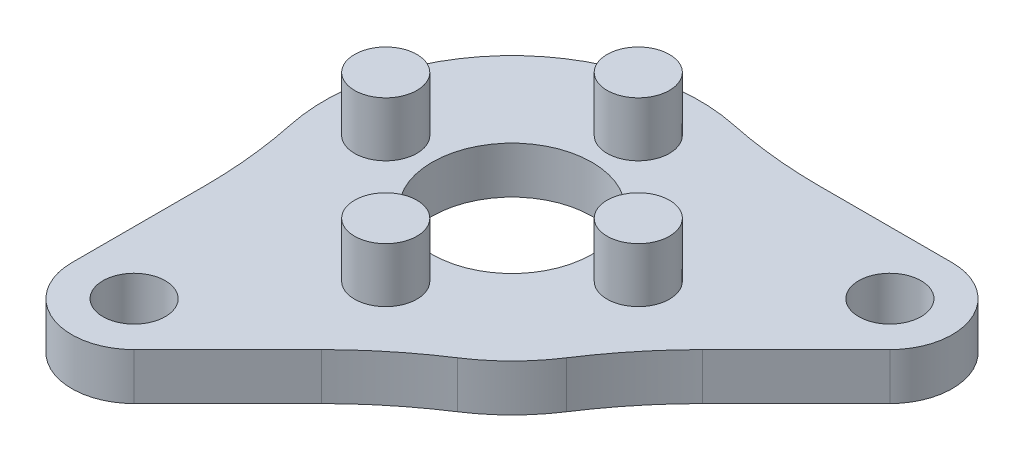
ISO-10303-21;
HEADER;
FILE_DESCRIPTION(('STEP AP214'),'2;1');
FILE_NAME('part.step','',(''),(''),'','','');
FILE_SCHEMA(('AUTOMOTIVE_DESIGN { 1 0 10303 214 1 1 1 1 }'));
ENDSEC;
DATA;
#1=APPLICATION_CONTEXT('core data for automotive mechanical design processes');
#2=APPLICATION_PROTOCOL_DEFINITION('international standard','automotive_design',2000,#1);
#3=PRODUCT_CONTEXT('',#1,'mechanical');
#4=PRODUCT('Part','Part','',(#3));
#5=PRODUCT_RELATED_PRODUCT_CATEGORY('part','',(#4));
#6=PRODUCT_DEFINITION_FORMATION('','',#4);
#7=PRODUCT_DEFINITION_CONTEXT('part definition',#1,'design');
#8=PRODUCT_DEFINITION('design','',#6,#7);
#9=PRODUCT_DEFINITION_SHAPE('','',#8);
#10=(LENGTH_UNIT() NAMED_UNIT(*) SI_UNIT(.MILLI.,.METRE.));
#11=(NAMED_UNIT(*) PLANE_ANGLE_UNIT() SI_UNIT($,.RADIAN.));
#12=(NAMED_UNIT(*) SI_UNIT($,.STERADIAN.) SOLID_ANGLE_UNIT());
#13=UNCERTAINTY_MEASURE_WITH_UNIT(LENGTH_MEASURE(1.E-05),#10,'distance_accuracy_value','');
#14=(GEOMETRIC_REPRESENTATION_CONTEXT(3) GLOBAL_UNCERTAINTY_ASSIGNED_CONTEXT((#13)) GLOBAL_UNIT_ASSIGNED_CONTEXT((#10,
#11,#12)) REPRESENTATION_CONTEXT('',''));
#15=CARTESIAN_POINT('',(0.,0.,0.));
#16=DIRECTION('',(0.,0.,1.));
#17=DIRECTION('',(1.,0.,0.));
#18=AXIS2_PLACEMENT_3D('',#15,#16,#17);
#19=CARTESIAN_POINT('',(7.84888527117066,3.,7.84888527117069));
#20=DIRECTION('',(-0.707106781186546,0.,-0.707106781186548));
#21=DIRECTION('',(-0.707106781186549,0.,0.707106781186546));
#22=AXIS2_PLACEMENT_3D('',#19,#20,#21);
#23=PLANE('',#22);
#24=DIRECTION('',(0.707106781186549,0.,-0.707106781186546));
#25=VECTOR('',#24,1.);
#26=CARTESIAN_POINT('',(7.84888527117066,3.,7.84888527117069));
#27=LINE('',#26,#25);
#28=CARTESIAN_POINT('',(13.9640304043626,3.,1.73374013797876));
#29=VERTEX_POINT('',#28);
#30=CARTESIAN_POINT('',(19.9693434175952,3.,-4.27157287525381));
#31=VERTEX_POINT('',#30);
#32=EDGE_CURVE('E141',#29,#31,#27,.T.);
#33=ORIENTED_EDGE('',*,*,#32,.F.);
#34=DIRECTION('',(0.,1.,0.));
#35=VECTOR('',#34,1.);
#36=CARTESIAN_POINT('',(13.9640304043626,3.,1.73374013797876));
#37=LINE('',#36,#35);
#38=CARTESIAN_POINT('',(13.9640304043626,0.,1.73374013797876));
#39=VERTEX_POINT('',#38);
#40=EDGE_CURVE('E166',#29,#39,#37,.F.);
#41=ORIENTED_EDGE('',*,*,#40,.T.);
#42=DIRECTION('',(0.707106781186549,0.,-0.707106781186546));
#43=VECTOR('',#42,1.);
#44=CARTESIAN_POINT('',(7.84888527117066,0.,7.84888527117069));
#45=LINE('',#44,#43);
#46=CARTESIAN_POINT('',(19.9693434175952,0.,-4.27157287525381));
#47=VERTEX_POINT('',#46);
#48=EDGE_CURVE('E229',#39,#47,#45,.T.);
#49=ORIENTED_EDGE('',*,*,#48,.T.);
#50=DIRECTION('',(0.,-1.,0.));
#51=VECTOR('',#50,1.);
#52=CARTESIAN_POINT('',(19.9693434175952,3.,-4.27157287525381));
#53=LINE('',#52,#51);
#54=EDGE_CURVE('E151',#31,#47,#53,.T.);
#55=ORIENTED_EDGE('',*,*,#54,.F.);
#56=EDGE_LOOP('',(#33,#41,#49,#55));
#57=FACE_BOUND('',#56,.T.);
#58=ADVANCED_FACE('F37',(#57),#23,.F.);
#59=CARTESIAN_POINT('',(-11.1,3.,0.));
#60=DIRECTION('',(1.,0.,0.));
#61=DIRECTION('',(0.,0.,-1.));
#62=AXIS2_PLACEMENT_3D('',#59,#60,#61);
#63=PLANE('',#62);
#64=DIRECTION('',(0.,0.,1.));
#65=VECTOR('',#64,1.);
#66=CARTESIAN_POINT('',(-11.1,3.,0.));
#67=LINE('',#66,#65);
#68=CARTESIAN_POINT('',(-11.1,3.,8.64812118323973));
#69=VERTEX_POINT('',#68);
#70=CARTESIAN_POINT('',(-11.1000000000001,3.,17.140916292849));
#71=VERTEX_POINT('',#70);
#72=EDGE_CURVE('E122',#69,#71,#67,.T.);
#73=ORIENTED_EDGE('',*,*,#72,.F.);
#74=DIRECTION('',(0.,1.,0.));
#75=VECTOR('',#74,1.);
#76=CARTESIAN_POINT('',(-11.1,3.,8.64812118323973));
#77=LINE('',#76,#75);
#78=CARTESIAN_POINT('',(-11.1,0.,8.64812118323973));
#79=VERTEX_POINT('',#78);
#80=EDGE_CURVE('E169',#69,#79,#77,.F.);
#81=ORIENTED_EDGE('',*,*,#80,.T.);
#82=DIRECTION('',(0.,0.,1.));
#83=VECTOR('',#82,1.);
#84=CARTESIAN_POINT('',(-11.1,0.,0.));
#85=LINE('',#84,#83);
#86=CARTESIAN_POINT('',(-11.1000000000001,0.,17.140916292849));
#87=VERTEX_POINT('',#86);
#88=EDGE_CURVE('E145',#79,#87,#85,.T.);
#89=ORIENTED_EDGE('',*,*,#88,.T.);
#90=DIRECTION('',(0.,-1.,0.));
#91=VECTOR('',#90,1.);
#92=CARTESIAN_POINT('',(-11.1000000000001,3.,17.140916292849));
#93=LINE('',#92,#91);
#94=EDGE_CURVE('E137',#71,#87,#93,.T.);
#95=ORIENTED_EDGE('',*,*,#94,.F.);
#96=EDGE_LOOP('',(#73,#81,#89,#95));
#97=FACE_BOUND('',#96,.T.);
#98=ADVANCED_FACE('F143',(#97),#63,.F.);
#99=CARTESIAN_POINT('',(-7.10000000000005,3.,17.140916292849));
#100=DIRECTION('',(0.,-1.,0.));
#101=DIRECTION('',(0.,0.,-1.));
#102=AXIS2_PLACEMENT_3D('',#99,#100,#101);
#103=CYLINDRICAL_SURFACE('',#102,4.);
#104=CARTESIAN_POINT('',(-7.10000000000005,0.,17.140916292849));
#105=DIRECTION('',(0.,1.,0.));
#106=DIRECTION('',(0.,0.,1.));
#107=AXIS2_PLACEMENT_3D('',#104,#105,#106);
#108=CIRCLE('',#107,4.);
#109=CARTESIAN_POINT('',(-4.27157287525387,0.,19.9693434175952));
#110=VERTEX_POINT('',#109);
#111=EDGE_CURVE('E296',#87,#110,#108,.T.);
#112=ORIENTED_EDGE('',*,*,#111,.T.);
#113=DIRECTION('',(0.,-1.,0.));
#114=VECTOR('',#113,1.);
#115=CARTESIAN_POINT('',(-4.27157287525387,3.,19.9693434175952));
#116=LINE('',#115,#114);
#117=CARTESIAN_POINT('',(-4.27157287525387,3.,19.9693434175952));
#118=VERTEX_POINT('',#117);
#119=EDGE_CURVE('E139',#118,#110,#116,.T.);
#120=ORIENTED_EDGE('',*,*,#119,.F.);
#121=CARTESIAN_POINT('',(-7.10000000000005,3.,17.140916292849));
#122=DIRECTION('',(0.,1.,0.));
#123=DIRECTION('',(0.,0.,1.));
#124=AXIS2_PLACEMENT_3D('',#121,#122,#123);
#125=CIRCLE('',#124,4.);
#126=EDGE_CURVE('E128',#71,#118,#125,.T.);
#127=ORIENTED_EDGE('',*,*,#126,.F.);
#128=ORIENTED_EDGE('',*,*,#94,.T.);
#129=EDGE_LOOP('',(#112,#120,#127,#128));
#130=FACE_BOUND('',#129,.T.);
#131=ADVANCED_FACE('F136',(#130),#103,.T.);
#132=CARTESIAN_POINT('',(1.73374013797871,0.,13.9640304043626));
#133=VERTEX_POINT('',#132);
#134=EDGE_CURVE('E226',#110,#133,#45,.T.);
#135=ORIENTED_EDGE('',*,*,#134,.T.);
#136=DIRECTION('',(0.,1.,0.));
#137=VECTOR('',#136,1.);
#138=CARTESIAN_POINT('',(1.73374013797871,3.,13.9640304043626));
#139=LINE('',#138,#137);
#140=CARTESIAN_POINT('',(1.73374013797871,3.,13.9640304043626));
#141=VERTEX_POINT('',#140);
#142=EDGE_CURVE('E159',#133,#141,#139,.T.);
#143=ORIENTED_EDGE('',*,*,#142,.T.);
#144=EDGE_CURVE('E238',#118,#141,#27,.T.);
#145=ORIENTED_EDGE('',*,*,#144,.F.);
#146=ORIENTED_EDGE('',*,*,#119,.T.);
#147=EDGE_LOOP('',(#135,#143,#145,#146));
#148=FACE_BOUND('',#147,.T.);
#149=ADVANCED_FACE('F205',(#148),#23,.F.);
#150=CARTESIAN_POINT('',(17.140916292849,3.,-7.1));
#151=DIRECTION('',(0.,-1.,0.));
#152=DIRECTION('',(0.,0.,-1.));
#153=AXIS2_PLACEMENT_3D('',#150,#151,#152);
#154=CYLINDRICAL_SURFACE('',#153,4.);
#155=CARTESIAN_POINT('',(17.140916292849,0.,-7.1));
#156=DIRECTION('',(0.,1.,0.));
#157=DIRECTION('',(0.,0.,1.));
#158=AXIS2_PLACEMENT_3D('',#155,#156,#157);
#159=CIRCLE('',#158,4.);
#160=CARTESIAN_POINT('',(17.140916292849,0.,-11.1));
#161=VERTEX_POINT('',#160);
#162=EDGE_CURVE('E228',#161,#47,#159,.F.);
#163=ORIENTED_EDGE('',*,*,#162,.F.);
#164=DIRECTION('',(0.,-1.,0.));
#165=VECTOR('',#164,1.);
#166=CARTESIAN_POINT('',(17.140916292849,3.,-11.1));
#167=LINE('',#166,#165);
#168=CARTESIAN_POINT('',(17.140916292849,3.,-11.1));
#169=VERTEX_POINT('',#168);
#170=EDGE_CURVE('E286',#169,#161,#167,.T.);
#171=ORIENTED_EDGE('',*,*,#170,.F.);
#172=CARTESIAN_POINT('',(17.140916292849,3.,-7.1));
#173=DIRECTION('',(0.,1.,0.));
#174=DIRECTION('',(0.,0.,1.));
#175=AXIS2_PLACEMENT_3D('',#172,#173,#174);
#176=CIRCLE('',#175,4.);
#177=EDGE_CURVE('E281',#169,#31,#176,.F.);
#178=ORIENTED_EDGE('',*,*,#177,.T.);
#179=ORIENTED_EDGE('',*,*,#54,.T.);
#180=EDGE_LOOP('',(#163,#171,#178,#179));
#181=FACE_BOUND('',#180,.T.);
#182=ADVANCED_FACE('F215',(#181),#154,.T.);
#183=CARTESIAN_POINT('',(0.,3.,-11.1));
#184=DIRECTION('',(0.,0.,-1.));
#185=DIRECTION('',(-1.,0.,0.));
#186=AXIS2_PLACEMENT_3D('',#183,#184,#185);
#187=PLANE('',#186);
#188=DIRECTION('',(1.,0.,0.));
#189=VECTOR('',#188,1.);
#190=CARTESIAN_POINT('',(0.,0.,-11.1));
#191=LINE('',#190,#189);
#192=CARTESIAN_POINT('',(8.64812118323977,0.,-11.1));
#193=VERTEX_POINT('',#192);
#194=EDGE_CURVE('E275',#193,#161,#191,.T.);
#195=ORIENTED_EDGE('',*,*,#194,.F.);
#196=DIRECTION('',(0.,-1.,0.));
#197=VECTOR('',#196,1.);
#198=CARTESIAN_POINT('',(8.64812118323977,3.,-11.1));
#199=LINE('',#198,#197);
#200=CARTESIAN_POINT('',(8.64812118323977,3.,-11.1));
#201=VERTEX_POINT('',#200);
#202=EDGE_CURVE('E157',#193,#201,#199,.F.);
#203=ORIENTED_EDGE('',*,*,#202,.T.);
#204=DIRECTION('',(1.,0.,0.));
#205=VECTOR('',#204,1.);
#206=CARTESIAN_POINT('',(0.,3.,-11.1));
#207=LINE('',#206,#205);
#208=EDGE_CURVE('E284',#201,#169,#207,.T.);
#209=ORIENTED_EDGE('',*,*,#208,.T.);
#210=ORIENTED_EDGE('',*,*,#170,.T.);
#211=EDGE_LOOP('',(#195,#203,#209,#210));
#212=FACE_BOUND('',#211,.T.);
#213=ADVANCED_FACE('F221',(#212),#187,.T.);
#214=CARTESIAN_POINT('',(17.140916292849,3.,-7.1));
#215=DIRECTION('',(0.,-1.,0.));
#216=DIRECTION('',(0.,0.,-1.));
#217=AXIS2_PLACEMENT_3D('',#214,#215,#216);
#218=CYLINDRICAL_SURFACE('',#217,2.);
#219=CARTESIAN_POINT('',(17.140916292849,3.,-7.1));
#220=DIRECTION('',(0.,1.,0.));
#221=DIRECTION('',(0.,0.,1.));
#222=AXIS2_PLACEMENT_3D('',#219,#220,#221);
#223=CIRCLE('',#222,2.);
#224=CARTESIAN_POINT('',(17.140916292849,3.,-5.1));
#225=VERTEX_POINT('',#224);
#226=EDGE_CURVE('E132',#225,#225,#223,.T.);
#227=ORIENTED_EDGE('',*,*,#226,.T.);
#228=EDGE_LOOP('',(#227));
#229=FACE_BOUND('',#228,.T.);
#230=CARTESIAN_POINT('',(17.140916292849,0.,-7.1));
#231=DIRECTION('',(0.,1.,0.));
#232=DIRECTION('',(0.,0.,1.));
#233=AXIS2_PLACEMENT_3D('',#230,#231,#232);
#234=CIRCLE('',#233,2.);
#235=CARTESIAN_POINT('',(17.140916292849,0.,-5.1));
#236=VERTEX_POINT('',#235);
#237=EDGE_CURVE('E292',#236,#236,#234,.T.);
#238=ORIENTED_EDGE('',*,*,#237,.F.);
#239=EDGE_LOOP('',(#238));
#240=FACE_BOUND('',#239,.T.);
#241=ADVANCED_FACE('F331',(#229,#240),#218,.F.);
#242=CARTESIAN_POINT('',(-7.10000000000005,3.,17.140916292849));
#243=DIRECTION('',(0.,-1.,0.));
#244=DIRECTION('',(0.,0.,-1.));
#245=AXIS2_PLACEMENT_3D('',#242,#243,#244);
#246=CYLINDRICAL_SURFACE('',#245,2.);
#247=CARTESIAN_POINT('',(-7.10000000000005,3.,17.140916292849));
#248=DIRECTION('',(0.,1.,0.));
#249=DIRECTION('',(0.,0.,1.));
#250=AXIS2_PLACEMENT_3D('',#247,#248,#249);
#251=CIRCLE('',#250,2.);
#252=CARTESIAN_POINT('',(-7.10000000000005,3.,19.140916292849));
#253=VERTEX_POINT('',#252);
#254=EDGE_CURVE('E274',#253,#253,#251,.F.);
#255=ORIENTED_EDGE('',*,*,#254,.F.);
#256=EDGE_LOOP('',(#255));
#257=FACE_BOUND('',#256,.T.);
#258=CARTESIAN_POINT('',(-7.10000000000005,0.,17.140916292849));
#259=DIRECTION('',(0.,1.,0.));
#260=DIRECTION('',(0.,0.,1.));
#261=AXIS2_PLACEMENT_3D('',#258,#259,#260);
#262=CIRCLE('',#261,2.);
#263=CARTESIAN_POINT('',(-7.10000000000005,0.,19.140916292849));
#264=VERTEX_POINT('',#263);
#265=EDGE_CURVE('E289',#264,#264,#262,.F.);
#266=ORIENTED_EDGE('',*,*,#265,.T.);
#267=EDGE_LOOP('',(#266));
#268=FACE_BOUND('',#267,.T.);
#269=ADVANCED_FACE('F327',(#257,#268),#246,.F.);
#270=CARTESIAN_POINT('',(0.,3.,0.));
#271=DIRECTION('',(0.,-1.,0.));
#272=DIRECTION('',(0.,0.,-1.));
#273=AXIS2_PLACEMENT_3D('',#270,#271,#272);
#274=CYLINDRICAL_SURFACE('',#273,5.125);
#275=CARTESIAN_POINT('',(0.,3.,0.));
#276=DIRECTION('',(0.,1.,0.));
#277=DIRECTION('',(0.,0.,1.));
#278=AXIS2_PLACEMENT_3D('',#275,#276,#277);
#279=CIRCLE('',#278,5.125);
#280=CARTESIAN_POINT('',(0.,3.,5.125));
#281=VERTEX_POINT('',#280);
#282=EDGE_CURVE('E271',#281,#281,#279,.T.);
#283=ORIENTED_EDGE('',*,*,#282,.T.);
#284=EDGE_LOOP('',(#283));
#285=FACE_BOUND('',#284,.T.);
#286=CARTESIAN_POINT('',(0.,0.,0.));
#287=DIRECTION('',(0.,1.,0.));
#288=DIRECTION('',(0.,0.,1.));
#289=AXIS2_PLACEMENT_3D('',#286,#287,#288);
#290=CIRCLE('',#289,5.125);
#291=CARTESIAN_POINT('',(0.,0.,5.125));
#292=VERTEX_POINT('',#291);
#293=EDGE_CURVE('E268',#292,#292,#290,.T.);
#294=ORIENTED_EDGE('',*,*,#293,.F.);
#295=EDGE_LOOP('',(#294));
#296=FACE_BOUND('',#295,.T.);
#297=ADVANCED_FACE('F324',(#285,#296),#274,.F.);
#298=CARTESIAN_POINT('',(0.,3.,0.));
#299=DIRECTION('',(0.,1.,0.));
#300=DIRECTION('',(0.,0.,1.));
#301=AXIS2_PLACEMENT_3D('',#298,#299,#300);
#302=PLANE('',#301);
#303=ORIENTED_EDGE('',*,*,#208,.F.);
#304=CARTESIAN_POINT('',(8.64812118323977,3.,-41.1));
#305=DIRECTION('',(0.,1.,0.));
#306=DIRECTION('',(0.,0.,1.));
#307=AXIS2_PLACEMENT_3D('',#304,#305,#306);
#308=CIRCLE('',#307,30.);
#309=CARTESIAN_POINT('',(2.47089176663993,3.,-11.7428571428571));
#310=VERTEX_POINT('',#309);
#311=EDGE_CURVE('E173',#201,#310,#308,.F.);
#312=ORIENTED_EDGE('',*,*,#311,.T.);
#313=CARTESIAN_POINT('',(0.,3.,0.));
#314=DIRECTION('',(0.,1.,0.));
#315=DIRECTION('',(0.,0.,1.));
#316=AXIS2_PLACEMENT_3D('',#313,#314,#315);
#317=CIRCLE('',#316,12.);
#318=CARTESIAN_POINT('',(-11.7428571428572,3.,2.4708917666399));
#319=VERTEX_POINT('',#318);
#320=EDGE_CURVE('E244',#310,#319,#317,.T.);
#321=ORIENTED_EDGE('',*,*,#320,.T.);
#322=CARTESIAN_POINT('',(-41.1,3.,8.64812118323964));
#323=DIRECTION('',(0.,1.,0.));
#324=DIRECTION('',(0.,0.,1.));
#325=AXIS2_PLACEMENT_3D('',#322,#323,#324);
#326=CIRCLE('',#325,30.);
#327=EDGE_CURVE('E11',#319,#69,#326,.F.);
#328=ORIENTED_EDGE('',*,*,#327,.T.);
#329=ORIENTED_EDGE('',*,*,#72,.T.);
#330=ORIENTED_EDGE('',*,*,#126,.T.);
#331=ORIENTED_EDGE('',*,*,#144,.T.);
#332=CARTESIAN_POINT('',(22.9469435735751,3.,35.1772338399591));
#333=DIRECTION('',(0.,1.,0.));
#334=DIRECTION('',(0.,0.,1.));
#335=AXIS2_PLACEMENT_3D('',#332,#333,#334);
#336=CIRCLE('',#335,30.);
#337=CARTESIAN_POINT('',(6.55626959245003,3.,10.0506382399883));
#338=VERTEX_POINT('',#337);
#339=EDGE_CURVE('E175',#141,#338,#336,.F.);
#340=ORIENTED_EDGE('',*,*,#339,.T.);
#341=CARTESIAN_POINT('',(10.0506382399883,3.,6.55626959245006));
#342=VERTEX_POINT('',#341);
#343=EDGE_CURVE('E236',#338,#342,#317,.T.);
#344=ORIENTED_EDGE('',*,*,#343,.T.);
#345=CARTESIAN_POINT('',(35.177233839959,3.,22.9469435735752));
#346=DIRECTION('',(0.,1.,0.));
#347=DIRECTION('',(0.,0.,1.));
#348=AXIS2_PLACEMENT_3D('',#345,#346,#347);
#349=CIRCLE('',#348,30.);
#350=EDGE_CURVE('E181',#342,#29,#349,.F.);
#351=ORIENTED_EDGE('',*,*,#350,.T.);
#352=ORIENTED_EDGE('',*,*,#32,.T.);
#353=ORIENTED_EDGE('',*,*,#177,.F.);
#354=EDGE_LOOP('',(#303,#312,#321,#328,#329,#330,#331,#340,#344,#351,#352,#353));
#355=FACE_BOUND('',#354,.T.);
#356=ORIENTED_EDGE('',*,*,#254,.T.);
#357=EDGE_LOOP('',(#356));
#358=FACE_BOUND('',#357,.T.);
#359=CARTESIAN_POINT('',(-8.1,3.,0.));
#360=DIRECTION('',(0.,1.,0.));
#361=DIRECTION('',(0.,0.,1.));
#362=AXIS2_PLACEMENT_3D('',#359,#360,#361);
#363=CIRCLE('',#362,2.);
#364=CARTESIAN_POINT('',(-8.1,3.,1.99999999999998));
#365=VERTEX_POINT('',#364);
#366=EDGE_CURVE('E192',#365,#365,#363,.T.);
#367=ORIENTED_EDGE('',*,*,#366,.F.);
#368=EDGE_LOOP('',(#367));
#369=FACE_BOUND('',#368,.T.);
#370=CARTESIAN_POINT('',(8.1,3.,0.));
#371=DIRECTION('',(0.,1.,0.));
#372=DIRECTION('',(0.,0.,-1.));
#373=AXIS2_PLACEMENT_3D('',#370,#371,#372);
#374=CIRCLE('',#373,2.);
#375=CARTESIAN_POINT('',(8.1,3.,-1.99999999999997));
#376=VERTEX_POINT('',#375);
#377=EDGE_CURVE('E250',#376,#376,#374,.T.);
#378=ORIENTED_EDGE('',*,*,#377,.F.);
#379=EDGE_LOOP('',(#378));
#380=FACE_BOUND('',#379,.T.);
#381=CARTESIAN_POINT('',(0.,3.,-8.1));
#382=DIRECTION('',(0.,1.,0.));
#383=DIRECTION('',(0.,0.,-1.));
#384=AXIS2_PLACEMENT_3D('',#381,#382,#383);
#385=CIRCLE('',#384,2.);
#386=CARTESIAN_POINT('',(0.,3.,-10.1));
#387=VERTEX_POINT('',#386);
#388=EDGE_CURVE('E256',#387,#387,#385,.T.);
#389=ORIENTED_EDGE('',*,*,#388,.F.);
#390=EDGE_LOOP('',(#389));
#391=FACE_BOUND('',#390,.T.);
#392=CARTESIAN_POINT('',(0.,3.,8.1));
#393=DIRECTION('',(0.,1.,0.));
#394=DIRECTION('',(0.,0.,1.));
#395=AXIS2_PLACEMENT_3D('',#392,#393,#394);
#396=CIRCLE('',#395,2.);
#397=CARTESIAN_POINT('',(0.,3.,10.1));
#398=VERTEX_POINT('',#397);
#399=EDGE_CURVE('E262',#398,#398,#396,.T.);
#400=ORIENTED_EDGE('',*,*,#399,.F.);
#401=EDGE_LOOP('',(#400));
#402=FACE_BOUND('',#401,.T.);
#403=ORIENTED_EDGE('',*,*,#282,.F.);
#404=EDGE_LOOP('',(#403));
#405=FACE_BOUND('',#404,.T.);
#406=ORIENTED_EDGE('',*,*,#226,.F.);
#407=EDGE_LOOP('',(#406));
#408=FACE_BOUND('',#407,.T.);
#409=ADVANCED_FACE('F125',(#355,#358,#369,#380,#391,#402,#405,#408),#302,.T.);
#410=CARTESIAN_POINT('',(0.,0.,0.));
#411=DIRECTION('',(0.,1.,0.));
#412=DIRECTION('',(0.,0.,1.));
#413=AXIS2_PLACEMENT_3D('',#410,#411,#412);
#414=PLANE('',#413);
#415=ORIENTED_EDGE('',*,*,#88,.F.);
#416=CARTESIAN_POINT('',(-41.1,0.,8.64812118323964));
#417=DIRECTION('',(0.,1.,0.));
#418=DIRECTION('',(0.,0.,1.));
#419=AXIS2_PLACEMENT_3D('',#416,#417,#418);
#420=CIRCLE('',#419,30.);
#421=CARTESIAN_POINT('',(-11.7428571428572,0.,2.4708917666399));
#422=VERTEX_POINT('',#421);
#423=EDGE_CURVE('E45',#79,#422,#420,.T.);
#424=ORIENTED_EDGE('',*,*,#423,.T.);
#425=CARTESIAN_POINT('',(0.,0.,0.));
#426=DIRECTION('',(0.,1.,0.));
#427=DIRECTION('',(0.,0.,1.));
#428=AXIS2_PLACEMENT_3D('',#425,#426,#427);
#429=CIRCLE('',#428,12.);
#430=CARTESIAN_POINT('',(2.47089176663993,0.,-11.7428571428571));
#431=VERTEX_POINT('',#430);
#432=EDGE_CURVE('E187',#422,#431,#429,.F.);
#433=ORIENTED_EDGE('',*,*,#432,.T.);
#434=CARTESIAN_POINT('',(8.64812118323977,0.,-41.1));
#435=DIRECTION('',(0.,1.,0.));
#436=DIRECTION('',(0.,0.,1.));
#437=AXIS2_PLACEMENT_3D('',#434,#435,#436);
#438=CIRCLE('',#437,30.);
#439=EDGE_CURVE('E171',#431,#193,#438,.T.);
#440=ORIENTED_EDGE('',*,*,#439,.T.);
#441=ORIENTED_EDGE('',*,*,#194,.T.);
#442=ORIENTED_EDGE('',*,*,#162,.T.);
#443=ORIENTED_EDGE('',*,*,#48,.F.);
#444=CARTESIAN_POINT('',(35.177233839959,0.,22.9469435735752));
#445=DIRECTION('',(0.,1.,0.));
#446=DIRECTION('',(0.,0.,1.));
#447=AXIS2_PLACEMENT_3D('',#444,#445,#446);
#448=CIRCLE('',#447,30.);
#449=CARTESIAN_POINT('',(10.0506382399883,0.,6.55626959245006));
#450=VERTEX_POINT('',#449);
#451=EDGE_CURVE('E179',#39,#450,#448,.T.);
#452=ORIENTED_EDGE('',*,*,#451,.T.);
#453=CARTESIAN_POINT('',(6.55626959245003,0.,10.0506382399883));
#454=VERTEX_POINT('',#453);
#455=EDGE_CURVE('E193',#450,#454,#429,.F.);
#456=ORIENTED_EDGE('',*,*,#455,.T.);
#457=CARTESIAN_POINT('',(22.9469435735751,0.,35.1772338399591));
#458=DIRECTION('',(0.,1.,0.));
#459=DIRECTION('',(0.,0.,1.));
#460=AXIS2_PLACEMENT_3D('',#457,#458,#459);
#461=CIRCLE('',#460,30.);
#462=EDGE_CURVE('E177',#454,#133,#461,.T.);
#463=ORIENTED_EDGE('',*,*,#462,.T.);
#464=ORIENTED_EDGE('',*,*,#134,.F.);
#465=ORIENTED_EDGE('',*,*,#111,.F.);
#466=EDGE_LOOP('',(#415,#424,#433,#440,#441,#442,#443,#452,#456,#463,#464,#465));
#467=FACE_BOUND('',#466,.T.);
#468=ORIENTED_EDGE('',*,*,#265,.F.);
#469=EDGE_LOOP('',(#468));
#470=FACE_BOUND('',#469,.T.);
#471=ORIENTED_EDGE('',*,*,#293,.T.);
#472=EDGE_LOOP('',(#471));
#473=FACE_BOUND('',#472,.T.);
#474=ORIENTED_EDGE('',*,*,#237,.T.);
#475=EDGE_LOOP('',(#474));
#476=FACE_BOUND('',#475,.T.);
#477=ADVANCED_FACE('F185',(#467,#470,#473,#476),#414,.F.);
#478=CARTESIAN_POINT('',(0.,6.5,8.1));
#479=DIRECTION('',(0.,-1.,0.));
#480=DIRECTION('',(0.,0.,-1.));
#481=AXIS2_PLACEMENT_3D('',#478,#479,#480);
#482=CYLINDRICAL_SURFACE('',#481,2.);
#483=CARTESIAN_POINT('',(0.,6.5,8.1));
#484=DIRECTION('',(0.,1.,0.));
#485=DIRECTION('',(0.,0.,1.));
#486=AXIS2_PLACEMENT_3D('',#483,#484,#485);
#487=CIRCLE('',#486,2.);
#488=CARTESIAN_POINT('',(0.,6.5,10.1));
#489=VERTEX_POINT('',#488);
#490=EDGE_CURVE('E265',#489,#489,#487,.T.);
#491=ORIENTED_EDGE('',*,*,#490,.F.);
#492=EDGE_LOOP('',(#491));
#493=FACE_BOUND('',#492,.T.);
#494=ORIENTED_EDGE('',*,*,#399,.T.);
#495=EDGE_LOOP('',(#494));
#496=FACE_BOUND('',#495,.T.);
#497=ADVANCED_FACE('F344',(#493,#496),#482,.T.);
#498=CARTESIAN_POINT('',(0.,6.5,8.1));
#499=DIRECTION('',(0.,1.,0.));
#500=DIRECTION('',(0.,0.,1.));
#501=AXIS2_PLACEMENT_3D('',#498,#499,#500);
#502=PLANE('',#501);
#503=ORIENTED_EDGE('',*,*,#490,.T.);
#504=EDGE_LOOP('',(#503));
#505=FACE_BOUND('',#504,.T.);
#506=ADVANCED_FACE('F351',(#505),#502,.T.);
#507=CARTESIAN_POINT('',(0.,6.5,-8.1));
#508=DIRECTION('',(0.,-1.,0.));
#509=DIRECTION('',(0.,0.,-1.));
#510=AXIS2_PLACEMENT_3D('',#507,#508,#509);
#511=CYLINDRICAL_SURFACE('',#510,2.);
#512=CARTESIAN_POINT('',(0.,6.5,-8.1));
#513=DIRECTION('',(0.,1.,0.));
#514=DIRECTION('',(0.,0.,-1.));
#515=AXIS2_PLACEMENT_3D('',#512,#513,#514);
#516=CIRCLE('',#515,2.);
#517=CARTESIAN_POINT('',(0.,6.5,-10.1));
#518=VERTEX_POINT('',#517);
#519=EDGE_CURVE('E259',#518,#518,#516,.T.);
#520=ORIENTED_EDGE('',*,*,#519,.F.);
#521=EDGE_LOOP('',(#520));
#522=FACE_BOUND('',#521,.T.);
#523=ORIENTED_EDGE('',*,*,#388,.T.);
#524=EDGE_LOOP('',(#523));
#525=FACE_BOUND('',#524,.T.);
#526=ADVANCED_FACE('F358',(#522,#525),#511,.T.);
#527=CARTESIAN_POINT('',(0.,6.5,-8.1));
#528=DIRECTION('',(0.,-1.,0.));
#529=DIRECTION('',(0.,0.,-1.));
#530=AXIS2_PLACEMENT_3D('',#527,#528,#529);
#531=PLANE('',#530);
#532=ORIENTED_EDGE('',*,*,#519,.T.);
#533=EDGE_LOOP('',(#532));
#534=FACE_BOUND('',#533,.T.);
#535=ADVANCED_FACE('F362',(#534),#531,.F.);
#536=CARTESIAN_POINT('',(8.1,6.5,0.));
#537=DIRECTION('',(0.,-1.,0.));
#538=DIRECTION('',(0.,0.,-1.));
#539=AXIS2_PLACEMENT_3D('',#536,#537,#538);
#540=CYLINDRICAL_SURFACE('',#539,2.);
#541=CARTESIAN_POINT('',(8.1,6.5,0.));
#542=DIRECTION('',(0.,1.,0.));
#543=DIRECTION('',(0.,0.,-1.));
#544=AXIS2_PLACEMENT_3D('',#541,#542,#543);
#545=CIRCLE('',#544,2.);
#546=CARTESIAN_POINT('',(8.1,6.5,-1.99999999999997));
#547=VERTEX_POINT('',#546);
#548=EDGE_CURVE('E253',#547,#547,#545,.T.);
#549=ORIENTED_EDGE('',*,*,#548,.F.);
#550=EDGE_LOOP('',(#549));
#551=FACE_BOUND('',#550,.T.);
#552=ORIENTED_EDGE('',*,*,#377,.T.);
#553=EDGE_LOOP('',(#552));
#554=FACE_BOUND('',#553,.T.);
#555=ADVANCED_FACE('F366',(#551,#554),#540,.T.);
#556=CARTESIAN_POINT('',(8.1,6.5,0.));
#557=DIRECTION('',(0.,-1.,0.));
#558=DIRECTION('',(0.,0.,-1.));
#559=AXIS2_PLACEMENT_3D('',#556,#557,#558);
#560=PLANE('',#559);
#561=ORIENTED_EDGE('',*,*,#548,.T.);
#562=EDGE_LOOP('',(#561));
#563=FACE_BOUND('',#562,.T.);
#564=ADVANCED_FACE('F370',(#563),#560,.F.);
#565=CARTESIAN_POINT('',(-8.1,6.5,0.));
#566=DIRECTION('',(0.,-1.,0.));
#567=DIRECTION('',(0.,0.,-1.));
#568=AXIS2_PLACEMENT_3D('',#565,#566,#567);
#569=CYLINDRICAL_SURFACE('',#568,2.);
#570=CARTESIAN_POINT('',(-8.1,6.5,0.));
#571=DIRECTION('',(0.,1.,0.));
#572=DIRECTION('',(0.,0.,1.));
#573=AXIS2_PLACEMENT_3D('',#570,#571,#572);
#574=CIRCLE('',#573,2.);
#575=CARTESIAN_POINT('',(-8.1,6.5,1.99999999999998));
#576=VERTEX_POINT('',#575);
#577=EDGE_CURVE('E247',#576,#576,#574,.T.);
#578=ORIENTED_EDGE('',*,*,#577,.F.);
#579=EDGE_LOOP('',(#578));
#580=FACE_BOUND('',#579,.T.);
#581=ORIENTED_EDGE('',*,*,#366,.T.);
#582=EDGE_LOOP('',(#581));
#583=FACE_BOUND('',#582,.T.);
#584=ADVANCED_FACE('F374',(#580,#583),#569,.T.);
#585=CARTESIAN_POINT('',(-8.1,6.5,0.));
#586=DIRECTION('',(0.,1.,0.));
#587=DIRECTION('',(0.,0.,1.));
#588=AXIS2_PLACEMENT_3D('',#585,#586,#587);
#589=PLANE('',#588);
#590=ORIENTED_EDGE('',*,*,#577,.T.);
#591=EDGE_LOOP('',(#590));
#592=FACE_BOUND('',#591,.T.);
#593=ADVANCED_FACE('F378',(#592),#589,.T.);
#594=CARTESIAN_POINT('',(0.,-33.9411254969543,0.));
#595=DIRECTION('',(0.,1.,0.));
#596=DIRECTION('',(0.,0.,1.));
#597=AXIS2_PLACEMENT_3D('',#594,#595,#596);
#598=CYLINDRICAL_SURFACE('',#597,12.);
#599=ORIENTED_EDGE('',*,*,#320,.F.);
#600=DIRECTION('',(0.,1.,0.));
#601=VECTOR('',#600,1.);
#602=CARTESIAN_POINT('',(2.47089176663993,-33.9411254969543,-11.7428571428571));
#603=LINE('',#602,#601);
#604=EDGE_CURVE('E149',#310,#431,#603,.F.);
#605=ORIENTED_EDGE('',*,*,#604,.T.);
#606=ORIENTED_EDGE('',*,*,#432,.F.);
#607=DIRECTION('',(0.,1.,0.));
#608=VECTOR('',#607,1.);
#609=CARTESIAN_POINT('',(-11.7428571428572,-33.9411254969543,2.4708917666399));
#610=LINE('',#609,#608);
#611=EDGE_CURVE('E147',#422,#319,#610,.T.);
#612=ORIENTED_EDGE('',*,*,#611,.T.);
#613=EDGE_LOOP('',(#599,#605,#606,#612));
#614=FACE_BOUND('',#613,.T.);
#615=ADVANCED_FACE('F190',(#614),#598,.T.);
#616=ORIENTED_EDGE('',*,*,#343,.F.);
#617=DIRECTION('',(0.,1.,0.));
#618=VECTOR('',#617,1.);
#619=CARTESIAN_POINT('',(6.55626959245003,-33.9411254969543,10.0506382399883));
#620=LINE('',#619,#618);
#621=EDGE_CURVE('E164',#338,#454,#620,.F.);
#622=ORIENTED_EDGE('',*,*,#621,.T.);
#623=ORIENTED_EDGE('',*,*,#455,.F.);
#624=DIRECTION('',(0.,1.,0.));
#625=VECTOR('',#624,1.);
#626=CARTESIAN_POINT('',(10.0506382399883,-33.9411254969543,6.55626959245006));
#627=LINE('',#626,#625);
#628=EDGE_CURVE('E162',#450,#342,#627,.T.);
#629=ORIENTED_EDGE('',*,*,#628,.T.);
#630=EDGE_LOOP('',(#616,#622,#623,#629));
#631=FACE_BOUND('',#630,.T.);
#632=ADVANCED_FACE('F240',(#631),#598,.T.);
#633=CARTESIAN_POINT('',(8.64812118323977,-33.9411254969543,-41.1));
#634=DIRECTION('',(0.,1.,0.));
#635=DIRECTION('',(0.,0.,1.));
#636=AXIS2_PLACEMENT_3D('',#633,#634,#635);
#637=CYLINDRICAL_SURFACE('',#636,30.);
#638=ORIENTED_EDGE('',*,*,#311,.F.);
#639=ORIENTED_EDGE('',*,*,#202,.F.);
#640=ORIENTED_EDGE('',*,*,#439,.F.);
#641=ORIENTED_EDGE('',*,*,#604,.F.);
#642=EDGE_LOOP('',(#638,#639,#640,#641));
#643=FACE_BOUND('',#642,.T.);
#644=ADVANCED_FACE('F314',(#643),#637,.F.);
#645=CARTESIAN_POINT('',(22.9469435735751,-33.9411254969543,35.1772338399591));
#646=DIRECTION('',(0.,1.,0.));
#647=DIRECTION('',(0.,0.,1.));
#648=AXIS2_PLACEMENT_3D('',#645,#646,#647);
#649=CYLINDRICAL_SURFACE('',#648,30.);
#650=ORIENTED_EDGE('',*,*,#462,.F.);
#651=ORIENTED_EDGE('',*,*,#621,.F.);
#652=ORIENTED_EDGE('',*,*,#339,.F.);
#653=ORIENTED_EDGE('',*,*,#142,.F.);
#654=EDGE_LOOP('',(#650,#651,#652,#653));
#655=FACE_BOUND('',#654,.T.);
#656=ADVANCED_FACE('F200',(#655),#649,.F.);
#657=CARTESIAN_POINT('',(35.177233839959,-33.9411254969543,22.9469435735752));
#658=DIRECTION('',(0.,1.,0.));
#659=DIRECTION('',(0.,0.,1.));
#660=AXIS2_PLACEMENT_3D('',#657,#658,#659);
#661=CYLINDRICAL_SURFACE('',#660,30.);
#662=ORIENTED_EDGE('',*,*,#350,.F.);
#663=ORIENTED_EDGE('',*,*,#628,.F.);
#664=ORIENTED_EDGE('',*,*,#451,.F.);
#665=ORIENTED_EDGE('',*,*,#40,.F.);
#666=EDGE_LOOP('',(#662,#663,#664,#665));
#667=FACE_BOUND('',#666,.T.);
#668=ADVANCED_FACE('F196',(#667),#661,.F.);
#669=CARTESIAN_POINT('',(-41.1,-33.9411254969543,8.64812118323964));
#670=DIRECTION('',(0.,1.,0.));
#671=DIRECTION('',(0.,0.,1.));
#672=AXIS2_PLACEMENT_3D('',#669,#670,#671);
#673=CYLINDRICAL_SURFACE('',#672,30.);
#674=ORIENTED_EDGE('',*,*,#327,.F.);
#675=ORIENTED_EDGE('',*,*,#611,.F.);
#676=ORIENTED_EDGE('',*,*,#423,.F.);
#677=ORIENTED_EDGE('',*,*,#80,.F.);
#678=EDGE_LOOP('',(#674,#675,#676,#677));
#679=FACE_BOUND('',#678,.T.);
#680=ADVANCED_FACE('F39',(#679),#673,.F.);
#681=CLOSED_SHELL('',(#58,#98,#131,#149,#182,#213,#241,#269,#297,#409,#477,#497,#506,#526,#535,
#555,#564,#584,#593,#615,#632,#644,#656,#668,#680));
#682=MANIFOLD_SOLID_BREP('B2',#681);
#683=ADVANCED_BREP_SHAPE_REPRESENTATION('',(#18,#682),#14);
#684=SHAPE_DEFINITION_REPRESENTATION(#9,#683);
ENDSEC;
END-ISO-10303-21;
